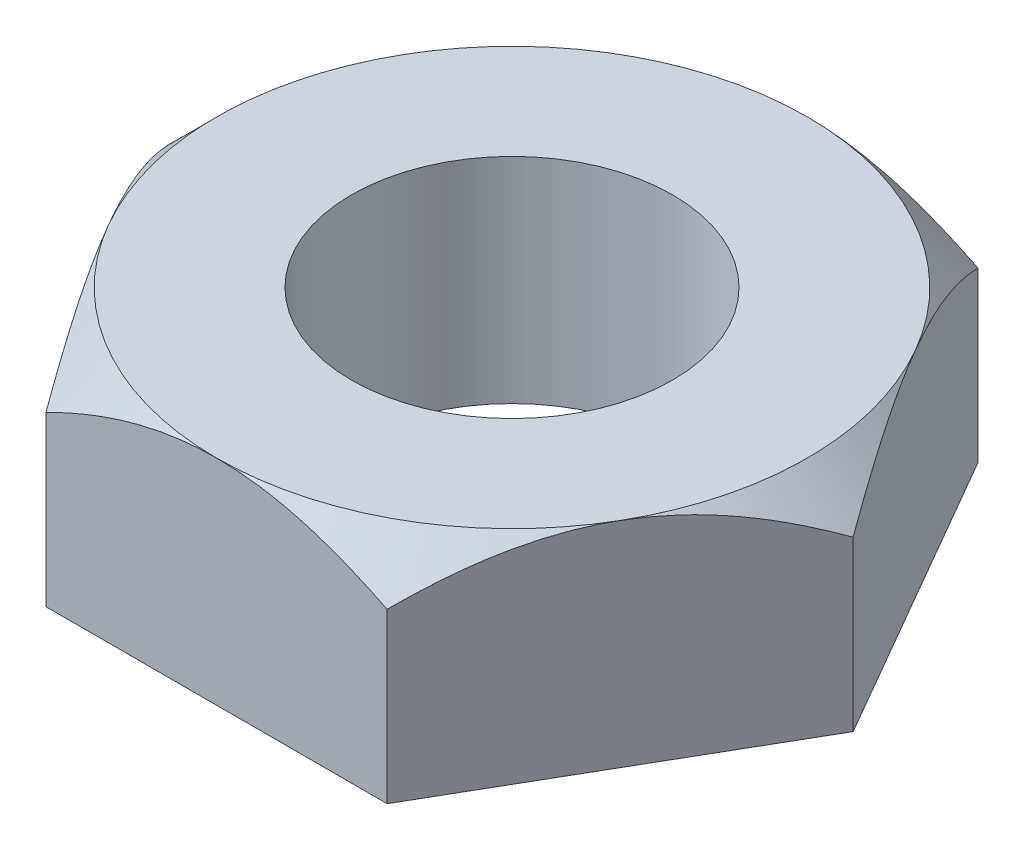
ISO-10303-21;
HEADER;
FILE_DESCRIPTION(('STEP AP214'),'2;1');
FILE_NAME('part.step','',(''),(''),'','','');
FILE_SCHEMA(('AUTOMOTIVE_DESIGN { 1 0 10303 214 1 1 1 1 }'));
ENDSEC;
DATA;
#1=APPLICATION_CONTEXT('core data for automotive mechanical design processes');
#2=APPLICATION_PROTOCOL_DEFINITION('international standard','automotive_design',2000,#1);
#3=PRODUCT_CONTEXT('',#1,'mechanical');
#4=PRODUCT('Part','Part','',(#3));
#5=PRODUCT_RELATED_PRODUCT_CATEGORY('part','',(#4));
#6=PRODUCT_DEFINITION_FORMATION('','',#4);
#7=PRODUCT_DEFINITION_CONTEXT('part definition',#1,'design');
#8=PRODUCT_DEFINITION('design','',#6,#7);
#9=PRODUCT_DEFINITION_SHAPE('','',#8);
#10=(LENGTH_UNIT() NAMED_UNIT(*) SI_UNIT(.MILLI.,.METRE.));
#11=(NAMED_UNIT(*) PLANE_ANGLE_UNIT() SI_UNIT($,.RADIAN.));
#12=(NAMED_UNIT(*) SI_UNIT($,.STERADIAN.) SOLID_ANGLE_UNIT());
#13=UNCERTAINTY_MEASURE_WITH_UNIT(LENGTH_MEASURE(1.E-05),#10,'distance_accuracy_value','');
#14=(GEOMETRIC_REPRESENTATION_CONTEXT(3) GLOBAL_UNCERTAINTY_ASSIGNED_CONTEXT((#13)) GLOBAL_UNIT_ASSIGNED_CONTEXT((#10,
#11,#12)) REPRESENTATION_CONTEXT('',''));
#15=CARTESIAN_POINT('',(0.,0.,0.));
#16=DIRECTION('',(0.,0.,1.));
#17=DIRECTION('',(1.,0.,0.));
#18=AXIS2_PLACEMENT_3D('',#15,#16,#17);
#19=CARTESIAN_POINT('',(-2.22044604925031E-13,12.5000000000002,-8.88178419700125E-13));
#20=DIRECTION('',(0.,1.,0.));
#21=DIRECTION('',(0.,0.,1.));
#22=AXIS2_PLACEMENT_3D('',#19,#20,#21);
#23=PLANE('',#22);
#24=CARTESIAN_POINT('',(-2.22044604925031E-13,12.5000000000002,-8.88178419700125E-13));
#25=DIRECTION('',(0.,1.,0.));
#26=DIRECTION('',(0.,0.,1.));
#27=AXIS2_PLACEMENT_3D('',#24,#25,#26);
#28=CIRCLE('',#27,18.75);
#29=CARTESIAN_POINT('',(-2.22565021967825E-13,12.5000000000002,18.7499999999991));
#30=VERTEX_POINT('',#29);
#31=EDGE_CURVE('E309',#30,#30,#28,.T.);
#32=ORIENTED_EDGE('',*,*,#31,.F.);
#33=EDGE_LOOP('',(#32));
#34=FACE_BOUND('',#33,.T.);
#35=CARTESIAN_POINT('',(-2.22044604925031E-13,12.5000000000002,-8.88178419700125E-13));
#36=DIRECTION('',(0.,1.,0.));
#37=DIRECTION('',(0.,0.,1.));
#38=AXIS2_PLACEMENT_3D('',#35,#36,#37);
#39=CIRCLE('',#38,34.5);
#40=CARTESIAN_POINT('',(-29.8778764305634,12.5000000000002,17.2499999999989));
#41=VERTEX_POINT('',#40);
#42=CARTESIAN_POINT('',(-2.22044604925031E-13,12.5000000000002,34.4999999999986));
#43=VERTEX_POINT('',#42);
#44=EDGE_CURVE('E155',#41,#43,#39,.T.);
#45=ORIENTED_EDGE('',*,*,#44,.T.);
#46=CARTESIAN_POINT('',(29.8778764305634,12.5000000000024,17.2499999999987));
#47=VERTEX_POINT('',#46);
#48=EDGE_CURVE('E131',#43,#47,#39,.T.);
#49=ORIENTED_EDGE('',*,*,#48,.T.);
#50=CARTESIAN_POINT('',(29.8778764305629,12.5000000000024,-17.2500000000002));
#51=VERTEX_POINT('',#50);
#52=EDGE_CURVE('E122',#47,#51,#39,.T.);
#53=ORIENTED_EDGE('',*,*,#52,.T.);
#54=CARTESIAN_POINT('',(-4.44089209850063E-13,12.4999999999997,-34.5000000000013));
#55=VERTEX_POINT('',#54);
#56=EDGE_CURVE('E69',#51,#55,#39,.T.);
#57=ORIENTED_EDGE('',*,*,#56,.T.);
#58=CARTESIAN_POINT('',(-29.8778764305633,12.5000000000002,-17.25));
#59=VERTEX_POINT('',#58);
#60=EDGE_CURVE('E73',#55,#59,#39,.T.);
#61=ORIENTED_EDGE('',*,*,#60,.T.);
#62=EDGE_CURVE('E159',#59,#41,#39,.T.);
#63=ORIENTED_EDGE('',*,*,#62,.T.);
#64=EDGE_LOOP('',(#45,#49,#53,#57,#61,#63));
#65=FACE_BOUND('',#64,.T.);
#66=ADVANCED_FACE('F42',(#34,#65),#23,.T.);
#67=CARTESIAN_POINT('',(19.9185842870426,12.5000000000002,34.4999999999984));
#68=DIRECTION('',(-0.866025403784442,0.,-0.499999999999996));
#69=DIRECTION('',(-0.499999999999996,0.,0.866025403784442));
#70=AXIS2_PLACEMENT_3D('',#67,#68,#69);
#71=PLANE('',#70);
#72=CARTESIAN_POINT('',(19.9184688169888,7.16271595536,34.5001999999985));
#73=CARTESIAN_POINT('',(20.2609064330095,7.50509746026353,33.9070806506278));
#74=CARTESIAN_POINT('',(20.6060258774001,7.83703105759164,33.3093162382632));
#75=CARTESIAN_POINT('',(21.302045761089,8.47668380394302,32.1037744366359));
#76=CARTESIAN_POINT('',(21.6529492327175,8.78438972934077,31.4959917952231));
#77=CARTESIAN_POINT('',(22.3626094509885,9.37357152050351,30.2668242410672));
#78=CARTESIAN_POINT('',(22.7213996575819,9.65488712591795,29.6453813739893));
#79=CARTESIAN_POINT('',(23.4448731210173,10.1851784375075,28.3922885773913));
#80=CARTESIAN_POINT('',(23.809555467321,10.4341590878032,27.7606402249699));
#81=CARTESIAN_POINT('',(24.5389204879797,10.8918858727041,26.4973429519255));
#82=CARTESIAN_POINT('',(24.9035131138701,11.1012027501785,25.8658499998184));
#83=CARTESIAN_POINT('',(25.6378697047824,11.4801830016189,24.5939070734852));
#84=CARTESIAN_POINT('',(26.0076339228207,11.6498444282287,23.9534566610219));
#85=CARTESIAN_POINT('',(26.7506510016065,11.9451967498277,22.6665133296736));
#86=CARTESIAN_POINT('',(27.1238936281482,12.0709899879915,22.020038136953));
#87=CARTESIAN_POINT('',(27.8735591371453,12.2758286124025,20.7215793866877));
#88=CARTESIAN_POINT('',(28.249981535901,12.3548809833566,20.0695966669355));
#89=CARTESIAN_POINT('',(28.8972588629571,12.4485018389402,18.9484794498871));
#90=CARTESIAN_POINT('',(29.1676946202353,12.4750148451499,18.4800709780981));
#91=CARTESIAN_POINT('',(29.7088862428974,12.5025846344725,17.5426995910168));
#92=CARTESIAN_POINT('',(29.979642091504,12.5036426973578,17.0737367047838));
#93=CARTESIAN_POINT('',(30.5209731671225,12.4802774378919,16.1361237780965));
#94=CARTESIAN_POINT('',(30.7915482937673,12.4558449249193,15.6674739114833));
#95=CARTESIAN_POINT('',(31.3318400708228,12.3818619414037,14.7316611027116));
#96=CARTESIAN_POINT('',(31.6015567064353,12.3323110402203,14.2644981861842));
#97=CARTESIAN_POINT('',(32.1398748180916,12.2087619795485,13.3321038661609));
#98=CARTESIAN_POINT('',(32.4084747809343,12.1347375575662,12.8668750836062));
#99=CARTESIAN_POINT('',(32.9437958210045,11.9633022174695,11.939671843844));
#100=CARTESIAN_POINT('',(33.2105168881165,11.8658911735455,11.4776974041572));
#101=CARTESIAN_POINT('',(33.7416511792806,11.6489787120484,10.5577458262187));
#102=CARTESIAN_POINT('',(34.0060647765428,11.5294809388238,10.0997680415484));
#103=CARTESIAN_POINT('',(34.5323490857843,11.2698130461661,9.18821687871615));
#104=CARTESIAN_POINT('',(34.7942195915675,11.1296412651379,8.7346438576963));
#105=CARTESIAN_POINT('',(35.4683958533015,10.7420658707175,7.56693631911651));
#106=CARTESIAN_POINT('',(35.8786169112637,10.4800736636557,6.85641260439058));
#107=CARTESIAN_POINT('',(36.6916483649013,9.91390135412466,5.44820081853805));
#108=CARTESIAN_POINT('',(37.0944585365013,9.60971997839086,4.75051313552157));
#109=CARTESIAN_POINT('',(37.8914764628388,8.9659219717893,3.37003759256203));
#110=CARTESIAN_POINT('',(38.2857067958519,8.62641678294161,2.68721062589852));
#111=CARTESIAN_POINT('',(38.8716032281722,8.09399071892971,1.67240823714619));
#112=CARTESIAN_POINT('',(39.0659430757271,7.91270509794403,1.33580174724596));
#113=CARTESIAN_POINT('',(39.4528920822667,7.5429569196056,0.665586407981141));
#114=CARTESIAN_POINT('',(39.6455013652519,7.354494881617,0.331977343841547));
#115=CARTESIAN_POINT('',(39.8372840441384,7.16271595536222,-0.000200000001226996));
#116=B_SPLINE_CURVE_WITH_KNOTS('',3,(#72,#73,#74,#75,#76,#77,#78,#79,#80,#81,#82,#83,#84,#85,
#86,#87,#88,#89,#90,#91,#92,#93,#94,#95,#96,#97,#98,#99,#100,#101,#102,#103,#104,#105,#106,#107,
#108,#109,#110,#111,#112,#113,#114,#115),.UNSPECIFIED.,.F.,.F.,(4,2,2,2,2,2,2,2,2,2,2,2,2,2,2,2,
2,2,2,2,2,4),(0.,2.29716343643264,4.59557211159846,6.90713979481505,9.2183536145759,
11.493250558525,13.7682591921507,16.0379242228684,18.3072500011216,19.9312579145987,
21.5551841793082,23.1796961526778,24.8042359783151,26.4305247840901,28.0568223387686,
29.6828517907119,31.3090119999006,33.8913592529942,36.4737844580148,39.0482962319261,
40.3348703274368,41.6213514886572),.UNSPECIFIED.);
#117=CARTESIAN_POINT('',(19.9185842870427,7.16283142591578,34.4999999999984));
#118=VERTEX_POINT('',#117);
#119=EDGE_CURVE('E140',#118,#47,#116,.T.);
#120=ORIENTED_EDGE('',*,*,#119,.F.);
#121=DIRECTION('',(0.,-1.,0.));
#122=VECTOR('',#121,1.);
#123=CARTESIAN_POINT('',(19.9185842870426,12.5000000000002,34.4999999999984));
#124=LINE('',#123,#122);
#125=CARTESIAN_POINT('',(19.9185842870429,-12.5000000000002,34.4999999999993));
#126=VERTEX_POINT('',#125);
#127=EDGE_CURVE('E271',#118,#126,#124,.T.);
#128=ORIENTED_EDGE('',*,*,#127,.T.);
#129=DIRECTION('',(0.499999999999995,0.,-0.866025403784443));
#130=VECTOR('',#129,1.);
#131=CARTESIAN_POINT('',(19.9185842870429,-12.5000000000002,34.4999999999993));
#132=LINE('',#131,#130);
#133=CARTESIAN_POINT('',(39.8371685740847,-12.4999999999975,-1.33226762955019E-12));
#134=VERTEX_POINT('',#133);
#135=EDGE_CURVE('E307',#126,#134,#132,.T.);
#136=ORIENTED_EDGE('',*,*,#135,.T.);
#137=DIRECTION('',(0.,-1.,0.));
#138=VECTOR('',#137,1.);
#139=CARTESIAN_POINT('',(39.8371685740844,12.5000000000024,-1.33226762955019E-12));
#140=LINE('',#139,#138);
#141=CARTESIAN_POINT('',(39.8371685740845,7.16283142591845,-1.33226762955019E-12));
#142=VERTEX_POINT('',#141);
#143=EDGE_CURVE('E146',#142,#134,#140,.T.);
#144=ORIENTED_EDGE('',*,*,#143,.F.);
#145=EDGE_CURVE('E130',#47,#142,#116,.T.);
#146=ORIENTED_EDGE('',*,*,#145,.F.);
#147=EDGE_LOOP('',(#120,#128,#136,#144,#146));
#148=FACE_BOUND('',#147,.T.);
#149=ADVANCED_FACE('F46',(#148),#71,.F.);
#150=CARTESIAN_POINT('',(39.8371685740844,12.5000000000024,-1.33226762955019E-12));
#151=DIRECTION('',(-0.866025403784438,0.,0.500000000000001));
#152=DIRECTION('',(0.500000000000001,0.,0.866025403784438));
#153=AXIS2_PLACEMENT_3D('',#150,#151,#152);
#154=PLANE('',#153);
#155=CARTESIAN_POINT('',(39.8372840441382,7.16271595536222,0.000199999998784506));
#156=CARTESIAN_POINT('',(39.4948464281171,7.50509746026423,-0.592919349372533));
#157=CARTESIAN_POINT('',(39.1497269837264,7.83703105759168,-1.19068376173722));
#158=CARTESIAN_POINT('',(38.4537071000375,8.47668380394254,-2.39622556336461));
#159=CARTESIAN_POINT('',(38.1028036284091,8.78438972934041,-3.00400820477725));
#160=CARTESIAN_POINT('',(37.3931434101381,9.37357152050323,-4.23317575893305));
#161=CARTESIAN_POINT('',(37.0343532035447,9.65488712591762,-4.85461862601094));
#162=CARTESIAN_POINT('',(36.3108797401093,10.1851784375071,-6.1077114226089));
#163=CARTESIAN_POINT('',(35.9461973938057,10.4341590878028,-6.73935977503028));
#164=CARTESIAN_POINT('',(35.216832373147,10.8918858727037,-8.00265704807461));
#165=CARTESIAN_POINT('',(34.8522397472567,11.101202750178,-8.63415000018161));
#166=CARTESIAN_POINT('',(34.1178831563443,11.4801830016185,-9.90609292651479));
#167=CARTESIAN_POINT('',(33.7481189383061,11.6498444282283,-10.546543338978));
#168=CARTESIAN_POINT('',(33.0051018595205,11.9451967498271,-11.8334866703263));
#169=CARTESIAN_POINT('',(32.631859232979,12.0709899879908,-12.4799618630469));
#170=CARTESIAN_POINT('',(31.8821937239814,12.2758286124023,-13.7784206133117));
#171=CARTESIAN_POINT('',(31.5057713252252,12.3548809833572,-14.4304033330634));
#172=CARTESIAN_POINT('',(30.8584939981693,12.4485018389406,-15.5515205501118));
#173=CARTESIAN_POINT('',(30.5880582408916,12.4750148451497,-16.0199290219011));
#174=CARTESIAN_POINT('',(30.0468666182299,12.5025846344719,-16.9573004089826));
#175=CARTESIAN_POINT('',(29.7761107696232,12.5036426973574,-17.4262632952155));
#176=CARTESIAN_POINT('',(29.2347796940046,12.4802774378916,-18.3638762219027));
#177=CARTESIAN_POINT('',(28.9642045673597,12.455844924919,-18.832526088516));
#178=CARTESIAN_POINT('',(28.4239127903043,12.3818619414034,-19.7683388972877));
#179=CARTESIAN_POINT('',(28.1541961546918,12.33231104022,-20.2355018138151));
#180=CARTESIAN_POINT('',(27.6158780430354,12.2087619795483,-21.1678961338384));
#181=CARTESIAN_POINT('',(27.3472780801928,12.134737557566,-21.6331249163931));
#182=CARTESIAN_POINT('',(26.8119570401226,11.9633022174694,-22.5603281561553));
#183=CARTESIAN_POINT('',(26.5452359730106,11.8658911735453,-23.0223025958422));
#184=CARTESIAN_POINT('',(26.0141016818464,11.6489787120483,-23.9422541737806));
#185=CARTESIAN_POINT('',(25.7496880845841,11.5294809388237,-24.4002319584508));
#186=CARTESIAN_POINT('',(25.2234037753429,11.2698130461661,-25.3117831212833));
#187=CARTESIAN_POINT('',(24.96153326956,11.1296412651379,-25.7653561423034));
#188=CARTESIAN_POINT('',(24.2873570078262,10.7420658707175,-26.9330636808834));
#189=CARTESIAN_POINT('',(23.8771359498634,10.4800736636557,-27.6435873956091));
#190=CARTESIAN_POINT('',(23.0641044962252,9.91390135412452,-29.0517991814615));
#191=CARTESIAN_POINT('',(22.6612943246253,9.6097199783907,-29.7494868644782));
#192=CARTESIAN_POINT('',(21.8642763982879,8.96592197178909,-31.129962407438));
#193=CARTESIAN_POINT('',(21.4700460652747,8.62641678294139,-31.8127893741016));
#194=CARTESIAN_POINT('',(20.8841496329542,8.09399071892938,-32.8275917628539));
#195=CARTESIAN_POINT('',(20.6898097853993,7.91270509794367,-33.1641982527542));
#196=CARTESIAN_POINT('',(20.3028607788597,7.54295691960528,-33.8344135920192));
#197=CARTESIAN_POINT('',(20.1102514958747,7.35449488161677,-34.1680226561589));
#198=CARTESIAN_POINT('',(19.9184688169884,7.16271595536222,-34.5002000000021));
#199=B_SPLINE_CURVE_WITH_KNOTS('',3,(#155,#156,#157,#158,#159,#160,#161,#162,#163,#164,#165,
#166,#167,#168,#169,#170,#171,#172,#173,#174,#175,#176,#177,#178,#179,#180,#181,#182,#183,#184,
#185,#186,#187,#188,#189,#190,#191,#192,#193,#194,#195,#196,#197,#198),.UNSPECIFIED.,.F.,.F.,(4,
2,2,2,2,2,2,2,2,2,2,2,2,2,2,2,2,2,2,2,2,4),(0.,2.29716343643233,4.59557211159793,
6.90713979481446,9.21835361457522,11.4932505585242,13.7682591921497,16.0379242228671,
18.3072500011201,19.9312579145971,21.5551841793066,23.1796961526763,24.8042359783135,
26.4305247840886,28.0568223387671,29.6828517907104,31.3090119998991,33.891359252993,
36.4737844580139,39.0482962319255,40.3348703274363,41.6213514886569),.UNSPECIFIED.);
#200=EDGE_CURVE('E129',#142,#51,#199,.T.);
#201=ORIENTED_EDGE('',*,*,#200,.F.);
#202=ORIENTED_EDGE('',*,*,#143,.T.);
#203=DIRECTION('',(-0.500000000000002,0.,-0.866025403784439));
#204=VECTOR('',#203,1.);
#205=CARTESIAN_POINT('',(39.8371685740847,-12.4999999999975,-1.33226762955019E-12));
#206=LINE('',#205,#204);
#207=CARTESIAN_POINT('',(19.9185842870424,-12.4999999999975,-34.5000000000013));
#208=VERTEX_POINT('',#207);
#209=EDGE_CURVE('E305',#134,#208,#206,.T.);
#210=ORIENTED_EDGE('',*,*,#209,.T.);
#211=DIRECTION('',(0.,-1.,0.));
#212=VECTOR('',#211,1.);
#213=CARTESIAN_POINT('',(19.9185842870416,12.5000000000024,-34.5000000000013));
#214=LINE('',#213,#212);
#215=CARTESIAN_POINT('',(19.9185842870421,7.16283142591845,-34.5000000000013));
#216=VERTEX_POINT('',#215);
#217=EDGE_CURVE('E274',#216,#208,#214,.T.);
#218=ORIENTED_EDGE('',*,*,#217,.F.);
#219=EDGE_CURVE('E227',#51,#216,#199,.T.);
#220=ORIENTED_EDGE('',*,*,#219,.F.);
#221=EDGE_LOOP('',(#201,#202,#210,#218,#220));
#222=FACE_BOUND('',#221,.T.);
#223=ADVANCED_FACE('F232',(#222),#154,.F.);
#224=CARTESIAN_POINT('',(19.9185842870416,12.5000000000024,-34.5000000000013));
#225=DIRECTION('',(0.,0.,1.));
#226=DIRECTION('',(1.,0.,0.));
#227=AXIS2_PLACEMENT_3D('',#224,#225,#226);
#228=PLANE('',#227);
#229=CARTESIAN_POINT('',(66.9506883522615,-28.3169613755203,-34.5000000000004));
#230=CARTESIAN_POINT('',(65.9736327545982,-27.4484686811342,-34.5000000000011));
#231=CARTESIAN_POINT('',(64.9946224100821,-26.5821681214265,-34.5000000000014));
#232=CARTESIAN_POINT('',(63.0321488539924,-24.8546021956364,-34.5000000000016));
#233=CARTESIAN_POINT('',(62.0486855879725,-23.993336891417,-34.5000000000015));
#234=CARTESIAN_POINT('',(60.0764195265404,-22.2761940103534,-34.5000000000014));
#235=CARTESIAN_POINT('',(59.087614878827,-21.4203185596664,-34.5000000000014));
#236=CARTESIAN_POINT('',(57.1043892947474,-19.7151017929185,-34.5000000000015));
#237=CARTESIAN_POINT('',(56.1099683743324,-18.8657604583159,-34.5000000000014));
#238=CARTESIAN_POINT('',(54.1012147585473,-17.1631010868209,-34.5000000000014));
#239=CARTESIAN_POINT('',(53.0867950366648,-16.3098856461328,-34.5000000000014));
#240=CARTESIAN_POINT('',(51.0505026010359,-14.6123972311891,-34.5000000000014));
#241=CARTESIAN_POINT('',(50.0286299218511,-13.7681242155092,-34.5000000000014));
#242=CARTESIAN_POINT('',(47.9765422469095,-12.0901828468019,-34.5000000000014));
#243=CARTESIAN_POINT('',(46.9463289353291,-11.2565124361504,-34.5000000000014));
#244=CARTESIAN_POINT('',(44.8760715696732,-9.60145739833297,-34.5000000000014));
#245=CARTESIAN_POINT('',(43.8360275414987,-8.78007273881243,-34.5000000000013));
#246=CARTESIAN_POINT('',(41.7931830317413,-7.18974481993274,-34.5000000000013));
#247=CARTESIAN_POINT('',(40.7908991065664,-6.42013889173549,-34.5000000000014));
#248=CARTESIAN_POINT('',(38.7743871386093,-4.89669155464126,-34.5000000000014));
#249=CARTESIAN_POINT('',(37.7601590017218,-4.14285027007987,-34.5000000000014));
#250=CARTESIAN_POINT('',(35.7172343535382,-2.65361461719196,-34.5000000000014));
#251=CARTESIAN_POINT('',(34.6885290857886,-1.9182322342394,-34.5000000000014));
#252=CARTESIAN_POINT('',(32.6150668279873,-0.470429043522095,-34.5000000000014));
#253=CARTESIAN_POINT('',(31.5703101280144,0.241992178473976,-34.5000000000014));
#254=CARTESIAN_POINT('',(29.4656590453809,1.63640597251875,-34.5000000000013));
#255=CARTESIAN_POINT('',(28.4058271847102,2.31849258500111,-34.5000000000013));
#256=CARTESIAN_POINT('',(26.2645519912572,3.64827301364169,-34.5000000000014));
#257=CARTESIAN_POINT('',(25.1831065803661,4.29596350055789,-34.5000000000014));
#258=CARTESIAN_POINT('',(22.996673603827,5.54768666168909,-34.5000000000012));
#259=CARTESIAN_POINT('',(21.8917127483781,6.15176576888,-34.500000000001));
#260=CARTESIAN_POINT('',(19.6540532414779,7.306005111325,-34.5000000000017));
#261=CARTESIAN_POINT('',(18.5213628042395,7.85618107818975,-34.5000000000026));
#262=CARTESIAN_POINT('',(16.8402981501277,8.6122489762866,-34.500000000002));
#263=CARTESIAN_POINT('',(16.3038438143352,8.84473227201407,-34.5000000000015));
#264=CARTESIAN_POINT('',(15.2242126732797,9.29343051127026,-34.5000000000011));
#265=CARTESIAN_POINT('',(14.6810360304632,9.50964584702863,-34.5000000000012));
#266=CARTESIAN_POINT('',(13.0411013558237,10.131349276362,-34.5000000000014));
#267=CARTESIAN_POINT('',(11.9338226343096,10.5099477102892,-34.5000000000013));
#268=CARTESIAN_POINT('',(10.2563319626624,11.011677394015,-34.5000000000013));
#269=CARTESIAN_POINT('',(9.69578159273481,11.1675948450646,-34.5000000000013));
#270=CARTESIAN_POINT('',(8.56870790800372,11.4559974511954,-34.5000000000012));
#271=CARTESIAN_POINT('',(8.0021853782302,11.5884856462992,-34.5000000000012));
#272=CARTESIAN_POINT('',(6.86381955970497,11.8282436529884,-34.5000000000013));
#273=CARTESIAN_POINT('',(6.29197632010594,11.9355136972989,-34.5000000000015));
#274=CARTESIAN_POINT('',(5.14388277987991,12.1232332873694,-34.500000000001));
#275=CARTESIAN_POINT('',(4.56763247869881,12.2036828297572,-34.5000000000002));
#276=CARTESIAN_POINT('',(3.40382280968844,12.3373793970671,-34.5000000000002));
#277=CARTESIAN_POINT('',(2.81621780477597,12.3902313860362,-34.500000000001));
#278=CARTESIAN_POINT('',(1.63907542969258,12.4660802700158,-34.5000000000015));
#279=CARTESIAN_POINT('',(1.04953806226327,12.4890772073658,-34.5000000000013));
#280=CARTESIAN_POINT('',(-0.129912051967752,12.5047947169678,-34.5000000000012));
#281=CARTESIAN_POINT('',(-0.719824777848304,12.4975168501631,-34.5000000000012));
#282=CARTESIAN_POINT('',(-1.89850361882136,12.4528224439892,-34.5000000000013));
#283=CARTESIAN_POINT('',(-2.48726972906466,12.4154057774351,-34.5000000000012));
#284=CARTESIAN_POINT('',(-3.66390366448901,12.3109561559243,-34.5000000000012));
#285=CARTESIAN_POINT('',(-4.25176373985411,12.2438363190931,-34.5000000000012));
#286=CARTESIAN_POINT('',(-5.42350823907122,12.0811259136675,-34.5000000000012));
#287=CARTESIAN_POINT('',(-6.00739267429339,11.9855354265329,-34.5000000000012));
#288=CARTESIAN_POINT('',(-7.17016225809938,11.7674151415771,-34.5000000000012));
#289=CARTESIAN_POINT('',(-7.74904677751324,11.6448820032829,-34.5000000000012));
#290=CARTESIAN_POINT('',(-8.90099226680359,11.3746713924687,-34.5000000000012));
#291=CARTESIAN_POINT('',(-9.47405215923479,11.2269893544595,-34.5000000000013));
#292=CARTESIAN_POINT('',(-10.8194754794184,10.8509120885648,-34.5000000000013));
#293=CARTESIAN_POINT('',(-11.5890814539463,10.6126284063252,-34.5000000000012));
#294=CARTESIAN_POINT('',(-13.1155204265282,10.0980998413656,-34.5000000000012));
#295=CARTESIAN_POINT('',(-13.8723513905921,9.82184897648294,-34.5000000000012));
#296=CARTESIAN_POINT('',(-15.3733670495634,9.23609309248045,-34.5000000000012));
#297=CARTESIAN_POINT('',(-16.1175458693756,8.92657308813269,-34.5000000000012));
#298=CARTESIAN_POINT('',(-17.5932052038206,8.27879989981454,-34.5000000000012));
#299=CARTESIAN_POINT('',(-18.3246860897291,7.94054755766087,-34.5000000000012));
#300=CARTESIAN_POINT('',(-19.7825988513505,7.23581938962351,-34.5000000000012));
#301=CARTESIAN_POINT('',(-20.508913864515,6.86910268081754,-34.5000000000012));
#302=CARTESIAN_POINT('',(-21.9500655006001,6.11383165570203,-34.5000000000011));
#303=CARTESIAN_POINT('',(-22.6649020716867,5.72527724081386,-34.5000000000011));
#304=CARTESIAN_POINT('',(-24.0837153395469,4.92945756782045,-34.5000000000012));
#305=CARTESIAN_POINT('',(-24.7876958690757,4.52219912506286,-34.5000000000014));
#306=CARTESIAN_POINT('',(-26.185938685745,3.69137176337252,-34.5000000000009));
#307=CARTESIAN_POINT('',(-26.8802009847293,3.26780286431992,-34.5000000000001));
#308=CARTESIAN_POINT('',(-28.4840865277051,2.266534463432,-34.4999999999998));
#309=CARTESIAN_POINT('',(-29.3903673590649,1.6834836576385,-34.5000000000008));
#310=CARTESIAN_POINT('',(-31.1892691200147,0.496625491035187,-34.5000000000015));
#311=CARTESIAN_POINT('',(-32.081889159337,-0.107183214303493,-34.5000000000012));
#312=CARTESIAN_POINT('',(-33.8552837421053,-1.33238284838423,-34.500000000001));
#313=CARTESIAN_POINT('',(-34.7360552945146,-1.95377809820664,-34.5000000000011));
#314=CARTESIAN_POINT('',(-36.4869548296835,-3.21132247223791,-34.5000000000011));
#315=CARTESIAN_POINT('',(-37.3570830293139,-3.847471295058,-34.5000000000011));
#316=CARTESIAN_POINT('',(-39.0893387617899,-5.13337840044921,-34.5000000000011));
#317=CARTESIAN_POINT('',(-39.9514515251384,-5.78315655065985,-34.5000000000011));
#318=CARTESIAN_POINT('',(-41.6673832698122,-7.09356773149919,-34.5000000000011));
#319=CARTESIAN_POINT('',(-42.5212022146998,-7.75420080978325,-34.5000000000011));
#320=CARTESIAN_POINT('',(-44.2213790335404,-9.08476075871798,-34.5000000000011));
#321=CARTESIAN_POINT('',(-45.0677378741331,-9.7546863954537,-34.5000000000011));
#322=CARTESIAN_POINT('',(-46.7539261640634,-11.1026946766511,-34.5000000000011));
#323=CARTESIAN_POINT('',(-47.5937556267286,-11.7807773044556,-34.5000000000011));
#324=CARTESIAN_POINT('',(-49.2198357426291,-13.1051794154728,-34.5000000000011));
#325=CARTESIAN_POINT('',(-50.0064089130204,-13.7511032097011,-34.5000000000011));
#326=CARTESIAN_POINT('',(-51.5749001242515,-15.0485806079995,-34.5000000000011));
#327=CARTESIAN_POINT('',(-52.3568181441551,-15.700134237357,-34.5000000000011));
#328=CARTESIAN_POINT('',(-54.6963438510256,-17.6623311271866,-34.500000000001));
#329=CARTESIAN_POINT('',(-56.2476722784196,-18.9804687919714,-34.500000000001));
#330=CARTESIAN_POINT('',(-58.5614353123103,-20.9671763257359,-34.500000000001));
#331=CARTESIAN_POINT('',(-59.3290492884637,-21.6297371098701,-34.500000000001));
#332=CARTESIAN_POINT('',(-60.8611622458126,-22.9584548425943,-34.500000000001));
#333=CARTESIAN_POINT('',(-61.6256612235562,-23.6246117951676,-34.500000000001));
#334=CARTESIAN_POINT('',(-63.1517480925454,-24.9601064450506,-34.500000000001));
#335=CARTESIAN_POINT('',(-63.913336248828,-25.6294438396935,-34.5000000000011));
#336=CARTESIAN_POINT('',(-65.433906580997,-26.9710651214693,-34.5000000000009));
#337=CARTESIAN_POINT('',(-66.1928887695311,-27.6433489942658,-34.5000000000006));
#338=CARTESIAN_POINT('',(-66.9506883522618,-28.3169613755203,-34.4999999999998));
#339=B_SPLINE_CURVE_WITH_KNOTS('',3,(#229,#230,#231,#232,#233,#234,#235,#236,#237,#238,#239,
#240,#241,#242,#243,#244,#245,#246,#247,#248,#249,#250,#251,#252,#253,#254,#255,#256,#257,#258,
#259,#260,#261,#262,#263,#264,#265,#266,#267,#268,#269,#270,#271,#272,#273,#274,#275,#276,#277,
#278,#279,#280,#281,#282,#283,#284,#285,#286,#287,#288,#289,#290,#291,#292,#293,#294,#295,#296,
#297,#298,#299,#300,#301,#302,#303,#304,#305,#306,#307,#308,#309,#310,#311,#312,#313,#314,#315,
#316,#317,#318,#319,#320,#321,#322,#323,#324,#325,#326,#327,#328,#329,#330,#331,#332,#333,#334,
#335,#336,#337,#338),.UNSPECIFIED.,.F.,.F.,(4,2,2,2,2,2,2,2,2,2,2,2,2,2,2,2,2,2,2,2,2,2,2,2,2,2,
2,2,2,2,2,2,2,2,2,2,2,2,2,2,2,2,2,2,2,2,2,2,2,2,2,2,2,2,4),(0.,3.92177036176121,
7.84358880541157,11.7668679460779,15.6901359496109,19.6666752226184,23.6431960668929,
27.6189330445183,31.5946595501851,35.385545114775,39.1764605667782,42.9697769226986,
46.7630248068625,50.5435505822898,54.3244416148673,58.1012458848345,61.8769445918053,
63.6306928488873,65.3843988085543,68.8914289961487,70.6365247866911,72.3813939789327,
74.1262470680568,75.8711003765644,77.6402887685832,79.409474651594,81.1785693180108,
82.9476714499988,84.721982770547,86.4962890145075,88.2708153692285,90.0456642125956,
92.4614344727442,94.8775858023438,97.2948300221992,99.7120034446407,102.152505399212,
104.593018371456,107.032649021074,109.47227669722,112.704817125402,115.937567327368,
119.171118844663,122.404604364436,125.643185629493,128.881781116382,132.119950605696,
135.358113483569,138.411481022114,141.464862282581,147.571822010162,150.613848024235,
153.655877408449,156.697622875062,159.739353558085),.UNSPECIFIED.);
#340=EDGE_CURVE('E234',#216,#55,#339,.T.);
#341=ORIENTED_EDGE('',*,*,#340,.F.);
#342=ORIENTED_EDGE('',*,*,#217,.T.);
#343=DIRECTION('',(-1.,0.,0.));
#344=VECTOR('',#343,1.);
#345=CARTESIAN_POINT('',(19.9185842870424,-12.4999999999975,-34.5000000000013));
#346=LINE('',#345,#344);
#347=CARTESIAN_POINT('',(-19.9185842870417,-12.5000000000002,-34.5000000000009));
#348=VERTEX_POINT('',#347);
#349=EDGE_CURVE('E298',#208,#348,#346,.T.);
#350=ORIENTED_EDGE('',*,*,#349,.T.);
#351=DIRECTION('',(0.,-1.,0.));
#352=VECTOR('',#351,1.);
#353=CARTESIAN_POINT('',(-19.9185842870426,12.5000000000002,-34.5000000000013));
#354=LINE('',#353,#352);
#355=CARTESIAN_POINT('',(-19.9185842870422,7.16283142591578,-34.5000000000013));
#356=VERTEX_POINT('',#355);
#357=EDGE_CURVE('E278',#356,#348,#354,.T.);
#358=ORIENTED_EDGE('',*,*,#357,.F.);
#359=EDGE_CURVE('E176',#55,#356,#339,.T.);
#360=ORIENTED_EDGE('',*,*,#359,.F.);
#361=EDGE_LOOP('',(#341,#342,#350,#358,#360));
#362=FACE_BOUND('',#361,.T.);
#363=ADVANCED_FACE('F237',(#362),#228,.F.);
#364=CARTESIAN_POINT('',(-19.9185842870426,12.5000000000002,-34.5000000000013));
#365=DIRECTION('',(0.866025403784443,0.,0.499999999999995));
#366=DIRECTION('',(0.499999999999995,0.,-0.866025403784443));
#367=AXIS2_PLACEMENT_3D('',#364,#365,#366);
#368=PLANE('',#367);
#369=CARTESIAN_POINT('',(-19.9184688169882,7.16271595536,-34.5002000000012));
#370=CARTESIAN_POINT('',(-20.2609064330094,7.50509746026319,-33.9070806506304));
#371=CARTESIAN_POINT('',(-20.6060258774003,7.83703105759118,-33.3093162382658));
#372=CARTESIAN_POINT('',(-21.3020457610894,8.47668380394253,-32.1037744366383));
#373=CARTESIAN_POINT('',(-21.6529492327178,8.78438972934037,-31.4959917952255));
#374=CARTESIAN_POINT('',(-22.3626094509889,9.37357152050317,-30.2668242410695));
#375=CARTESIAN_POINT('',(-22.7213996575822,9.65488712591759,-29.6453813739917));
#376=CARTESIAN_POINT('',(-23.4448731210176,10.1851784375071,-28.3922885773937));
#377=CARTESIAN_POINT('',(-23.8095554673213,10.4341590878028,-27.7606402249723));
#378=CARTESIAN_POINT('',(-24.53892048798,10.8918858727037,-26.4973429519279));
#379=CARTESIAN_POINT('',(-24.9035131138704,11.1012027501782,-25.8658499998209));
#380=CARTESIAN_POINT('',(-25.6378697047827,11.4801830016185,-24.5939070734875));
#381=CARTESIAN_POINT('',(-26.0076339228209,11.6498444282282,-23.9534566610242));
#382=CARTESIAN_POINT('',(-26.7506510016068,11.9451967498276,-22.666513329676));
#383=CARTESIAN_POINT('',(-27.1238936281487,12.0709899879919,-22.0200381369554));
#384=CARTESIAN_POINT('',(-27.8735591371456,12.2758286124017,-20.7215793866896));
#385=CARTESIAN_POINT('',(-28.2499815359008,12.354880983354,-20.0695966669369));
#386=CARTESIAN_POINT('',(-28.8972588629572,12.4485018389383,-18.9484794498884));
#387=CARTESIAN_POINT('',(-29.1676946202358,12.4750148451492,-18.4800709780998));
#388=CARTESIAN_POINT('',(-29.7088862428982,12.5025846344728,-17.5426995910188));
#389=CARTESIAN_POINT('',(-29.9796420915046,12.5036426973577,-17.0737367047857));
#390=CARTESIAN_POINT('',(-30.520973167123,12.4802774378916,-16.1361237780985));
#391=CARTESIAN_POINT('',(-30.7915482937678,12.4558449249191,-15.6674739114853));
#392=CARTESIAN_POINT('',(-31.3318400708232,12.3818619414035,-14.7316611027138));
#393=CARTESIAN_POINT('',(-31.6015567064356,12.3323110402201,-14.2644981861864));
#394=CARTESIAN_POINT('',(-32.1398748180919,12.2087619795484,-13.3321038661632));
#395=CARTESIAN_POINT('',(-32.4084747809346,12.1347375575662,-12.8668750836086));
#396=CARTESIAN_POINT('',(-32.9437958210047,11.9633022174695,-11.9396718438465));
#397=CARTESIAN_POINT('',(-33.2105168881165,11.8658911735453,-11.4776974041597));
#398=CARTESIAN_POINT('',(-33.7416511792808,11.6489787120486,-10.5577458262214));
#399=CARTESIAN_POINT('',(-34.0060647765432,11.5294809388244,-10.0997680415511));
#400=CARTESIAN_POINT('',(-34.532349085784,11.2698130461657,-9.18821687871887));
#401=CARTESIAN_POINT('',(-34.7942195915664,11.129641265136,-8.73464385769899));
#402=CARTESIAN_POINT('',(-35.4683958532999,10.7420658707147,-7.56693631911903));
#403=CARTESIAN_POINT('',(-35.8786169112635,10.480073663655,-6.85641260439301));
#404=CARTESIAN_POINT('',(-36.6916483649022,9.91390135412548,-5.44820081854034));
#405=CARTESIAN_POINT('',(-37.0944585365018,9.60971997839112,-4.7505131355238));
#406=CARTESIAN_POINT('',(-37.891476462839,8.96592197178906,-3.37003759256418));
#407=CARTESIAN_POINT('',(-38.2857067958522,8.62641678294142,-2.68721062590064));
#408=CARTESIAN_POINT('',(-38.8716032281728,8.09399071892975,-1.67240823714821));
#409=CARTESIAN_POINT('',(-39.0659430757278,7.91270509794417,-1.33580174724791));
#410=CARTESIAN_POINT('',(-39.4528920822671,7.54295691960525,-0.665586407983035));
#411=CARTESIAN_POINT('',(-39.6455013652519,7.35449488161606,-0.331977343843449));
#412=CARTESIAN_POINT('',(-39.8372840441376,7.16271595536,0.000199999999228595));
#413=B_SPLINE_CURVE_WITH_KNOTS('',3,(#369,#370,#371,#372,#373,#374,#375,#376,#377,#378,#379,
#380,#381,#382,#383,#384,#385,#386,#387,#388,#389,#390,#391,#392,#393,#394,#395,#396,#397,#398,
#399,#400,#401,#402,#403,#404,#405,#406,#407,#408,#409,#410,#411,#412),.UNSPECIFIED.,.F.,.F.,(4,
2,2,2,2,2,2,2,2,2,2,2,2,2,2,2,2,2,2,2,2,4),(0.,2.29716343643295,4.59557211159904,
6.90713979481549,9.21835361457624,11.4932505585255,13.7682591921511,16.037924222869,
18.3072500011226,19.9312579145997,21.5551841793091,23.1796961526785,24.8042359783156,
26.4305247840904,28.0568223387686,29.6828517907118,31.3090119999005,33.8913592529944,
36.4737844580152,39.0482962319266,40.3348703274375,41.6213514886582),.UNSPECIFIED.);
#414=EDGE_CURVE('E179',#356,#59,#413,.T.);
#415=ORIENTED_EDGE('',*,*,#414,.F.);
#416=ORIENTED_EDGE('',*,*,#357,.T.);
#417=DIRECTION('',(-0.499999999999995,0.,0.866025403784443));
#418=VECTOR('',#417,1.);
#419=CARTESIAN_POINT('',(-19.9185842870417,-12.5000000000002,-34.5000000000009));
#420=LINE('',#419,#418);
#421=CARTESIAN_POINT('',(-39.8371685740836,-12.4999999999997,-2.22044604925031E-13));
#422=VERTEX_POINT('',#421);
#423=EDGE_CURVE('E300',#348,#422,#420,.T.);
#424=ORIENTED_EDGE('',*,*,#423,.T.);
#425=DIRECTION('',(0.,-1.,0.));
#426=VECTOR('',#425,1.);
#427=CARTESIAN_POINT('',(-39.8371685740844,12.5000000000002,-1.11022302462516E-12));
#428=LINE('',#427,#426);
#429=CARTESIAN_POINT('',(-39.8371685740838,7.16283142591578,-1.11022302462516E-12));
#430=VERTEX_POINT('',#429);
#431=EDGE_CURVE('E189',#430,#422,#428,.T.);
#432=ORIENTED_EDGE('',*,*,#431,.F.);
#433=EDGE_CURVE('E174',#59,#430,#413,.T.);
#434=ORIENTED_EDGE('',*,*,#433,.F.);
#435=EDGE_LOOP('',(#415,#416,#424,#432,#434));
#436=FACE_BOUND('',#435,.T.);
#437=ADVANCED_FACE('F187',(#436),#368,.F.);
#438=CARTESIAN_POINT('',(-39.8371685740844,12.5000000000002,-1.11022302462516E-12));
#439=DIRECTION('',(0.866025403784435,0.,-0.500000000000008));
#440=DIRECTION('',(-0.500000000000008,0.,-0.866025403784435));
#441=AXIS2_PLACEMENT_3D('',#438,#439,#440);
#442=PLANE('',#441);
#443=CARTESIAN_POINT('',(-39.837284044138,7.16271595536,-0.000199999999894729));
#444=CARTESIAN_POINT('',(-39.494846428117,7.50509746026379,0.592919349370679));
#445=CARTESIAN_POINT('',(-39.1497269837263,7.83703105759202,1.19068376173513));
#446=CARTESIAN_POINT('',(-38.4537071000373,8.47668380394351,2.39622556336245));
#447=CARTESIAN_POINT('',(-38.1028036284088,8.78438972934125,3.00400820477526));
#448=CARTESIAN_POINT('',(-37.3931434101378,9.37357152050393,4.2331757589311));
#449=CARTESIAN_POINT('',(-37.0343532035445,9.65488712591833,4.85461862600885));
#450=CARTESIAN_POINT('',(-36.3108797401092,10.1851784375078,6.1077114226066));
#451=CARTESIAN_POINT('',(-35.9461973938056,10.4341590878034,6.7393597750279));
#452=CARTESIAN_POINT('',(-35.2168323731469,10.8918858727043,8.00265704807213));
#453=CARTESIAN_POINT('',(-34.8522397472566,11.1012027501788,8.63415000017911));
#454=CARTESIAN_POINT('',(-34.1178831563443,11.4801830016191,9.90609292651227));
#455=CARTESIAN_POINT('',(-33.7481189383061,11.6498444282287,10.5465433389755));
#456=CARTESIAN_POINT('',(-33.0051018595204,11.9451967498281,11.8334866703236));
#457=CARTESIAN_POINT('',(-32.6318592329787,12.0709899879926,12.4799618630442));
#458=CARTESIAN_POINT('',(-31.8821937239814,12.2758286124021,13.7784206133096));
#459=CARTESIAN_POINT('',(-31.5057713252256,12.3548809833539,14.430403333062));
#460=CARTESIAN_POINT('',(-30.8584939981694,12.4485018389384,15.5515205501106));
#461=CARTESIAN_POINT('',(-30.5880582408912,12.4750148451497,16.0199290218995));
#462=CARTESIAN_POINT('',(-30.0468666182291,12.5025846344736,16.9573004089808));
#463=CARTESIAN_POINT('',(-29.7761107696225,12.5036426973584,17.4262632952139));
#464=CARTESIAN_POINT('',(-29.2347796940039,12.4802774378922,18.3638762219012));
#465=CARTESIAN_POINT('',(-28.9642045673591,12.4558449249198,18.8325260885144));
#466=CARTESIAN_POINT('',(-28.4239127903036,12.3818619414042,19.7683388972861));
#467=CARTESIAN_POINT('',(-28.1541961546911,12.3323110402208,20.2355018138135));
#468=CARTESIAN_POINT('',(-27.6158780430347,12.2087619795491,21.1678961338369));
#469=CARTESIAN_POINT('',(-27.3472780801921,12.1347375575669,21.6331249163915));
#470=CARTESIAN_POINT('',(-26.8119570401218,11.9633022174701,22.5603281561537));
#471=CARTESIAN_POINT('',(-26.5452359730099,11.8658911735459,23.0223025958405));
#472=CARTESIAN_POINT('',(-26.0141016818457,11.6489787120492,23.9422541737791));
#473=CARTESIAN_POINT('',(-25.7496880845835,11.5294809388251,24.4002319584495));
#474=CARTESIAN_POINT('',(-25.223403775342,11.2698130461661,25.3117831212816));
#475=CARTESIAN_POINT('',(-24.9615332695589,11.1296412651361,25.765356142301));
#476=CARTESIAN_POINT('',(-24.2873570078249,10.7420658707146,26.9330636808808));
#477=CARTESIAN_POINT('',(-23.8771359498623,10.4800736636552,27.6435873956076));
#478=CARTESIAN_POINT('',(-23.0641044962243,9.91390135412587,29.0517991814608));
#479=CARTESIAN_POINT('',(-22.6612943246243,9.60971997839136,29.7494868644772));
#480=CARTESIAN_POINT('',(-21.8642763982868,8.96592197178915,31.1299624074367));
#481=CARTESIAN_POINT('',(-21.4700460652737,8.62641678294152,31.8127893741003));
#482=CARTESIAN_POINT('',(-20.8841496329532,8.0939907189298,32.8275917628528));
#483=CARTESIAN_POINT('',(-20.6898097853982,7.91270509794419,33.1641982527531));
#484=CARTESIAN_POINT('',(-20.3028607788587,7.54295691960524,33.834413592018));
#485=CARTESIAN_POINT('',(-20.1102514958738,7.35449488161605,34.1680226561575));
#486=CARTESIAN_POINT('',(-19.9184688169879,7.16271595536,34.5002000000001));
#487=B_SPLINE_CURVE_WITH_KNOTS('',3,(#443,#444,#445,#446,#447,#448,#449,#450,#451,#452,#453,
#454,#455,#456,#457,#458,#459,#460,#461,#462,#463,#464,#465,#466,#467,#468,#469,#470,#471,#472,
#473,#474,#475,#476,#477,#478,#479,#480,#481,#482,#483,#484,#485,#486),.UNSPECIFIED.,.F.,.F.,(4,
2,2,2,2,2,2,2,2,2,2,2,2,2,2,2,2,2,2,2,2,4),(0.,2.29716343643281,4.59557211159871,
6.90713979481485,9.21835361457531,11.4932505585243,13.7682591921496,16.0379242228673,
18.3072500011207,19.9312579145981,21.5551841793076,23.1796961526773,24.8042359783146,
26.4305247840896,28.056822338768,29.6828517907115,31.3090119999004,33.8913592529945,
36.4737844580155,39.048296231927,40.3348703274379,41.6213514886587),.UNSPECIFIED.);
#488=EDGE_CURVE('E160',#430,#41,#487,.T.);
#489=ORIENTED_EDGE('',*,*,#488,.F.);
#490=ORIENTED_EDGE('',*,*,#431,.T.);
#491=DIRECTION('',(0.500000000000008,0.,0.866025403784435));
#492=VECTOR('',#491,1.);
#493=CARTESIAN_POINT('',(-39.8371685740836,-12.4999999999997,-2.22044604925031E-13));
#494=LINE('',#493,#492);
#495=CARTESIAN_POINT('',(-19.9185842870415,-12.4999999999997,34.4999999999991));
#496=VERTEX_POINT('',#495);
#497=EDGE_CURVE('E294',#422,#496,#494,.T.);
#498=ORIENTED_EDGE('',*,*,#497,.T.);
#499=DIRECTION('',(0.,-1.,0.));
#500=VECTOR('',#499,1.);
#501=CARTESIAN_POINT('',(-19.9185842870422,12.5000000000002,34.4999999999989));
#502=LINE('',#501,#500);
#503=CARTESIAN_POINT('',(-19.9185842870419,7.16283142591578,34.4999999999989));
#504=VERTEX_POINT('',#503);
#505=EDGE_CURVE('E270',#504,#496,#502,.T.);
#506=ORIENTED_EDGE('',*,*,#505,.F.);
#507=EDGE_CURVE('E152',#41,#504,#487,.T.);
#508=ORIENTED_EDGE('',*,*,#507,.F.);
#509=EDGE_LOOP('',(#489,#490,#498,#506,#508));
#510=FACE_BOUND('',#509,.T.);
#511=ADVANCED_FACE('F241',(#510),#442,.F.);
#512=CARTESIAN_POINT('',(-19.9185842870422,12.5000000000002,34.4999999999989));
#513=DIRECTION('',(0.,0.,-1.));
#514=DIRECTION('',(-1.,0.,0.));
#515=AXIS2_PLACEMENT_3D('',#512,#513,#514);
#516=PLANE('',#515);
#517=CARTESIAN_POINT('',(-66.9506883522619,-28.3169613755203,34.5000000000004));
#518=CARTESIAN_POINT('',(-65.9736327545986,-27.4484686811341,34.4999999999997));
#519=CARTESIAN_POINT('',(-64.9946224100825,-26.5821681214263,34.4999999999994));
#520=CARTESIAN_POINT('',(-63.0321488539926,-24.8546021956361,34.4999999999992));
#521=CARTESIAN_POINT('',(-62.0486855879727,-23.9933368914166,34.4999999999993));
#522=CARTESIAN_POINT('',(-60.0764195265405,-22.2761940103529,34.4999999999993));
#523=CARTESIAN_POINT('',(-59.087614878827,-21.4203185596658,34.4999999999993));
#524=CARTESIAN_POINT('',(-57.1043892947473,-19.7151017929179,34.4999999999992));
#525=CARTESIAN_POINT('',(-56.1099683743322,-18.8657604583152,34.4999999999992));
#526=CARTESIAN_POINT('',(-54.101214758547,-17.16310108682,34.4999999999992));
#527=CARTESIAN_POINT('',(-53.0867950366644,-16.3098856461319,34.4999999999992));
#528=CARTESIAN_POINT('',(-51.0505026010354,-14.612397231188,34.4999999999992));
#529=CARTESIAN_POINT('',(-50.0286299218506,-13.768124215508,34.4999999999993));
#530=CARTESIAN_POINT('',(-47.9765422469088,-12.0901828468008,34.4999999999991));
#531=CARTESIAN_POINT('',(-46.9463289353281,-11.2565124361494,34.4999999999988));
#532=CARTESIAN_POINT('',(-44.8760715696725,-9.60145739833124,34.4999999999995));
#533=CARTESIAN_POINT('',(-43.8360275414986,-8.7800727388098,34.5000000000005));
#534=CARTESIAN_POINT('',(-41.7931830317411,-7.18974481993015,34.5000000000004));
#535=CARTESIAN_POINT('',(-40.7908991065657,-6.42013889173376,34.4999999999994));
#536=CARTESIAN_POINT('',(-38.7743871386082,-4.89669155464022,34.4999999999987));
#537=CARTESIAN_POINT('',(-37.7601590017209,-4.14285027007867,34.499999999999));
#538=CARTESIAN_POINT('',(-35.7172343535376,-2.65361461719071,34.4999999999991));
#539=CARTESIAN_POINT('',(-34.6885290857881,-1.91823223423828,34.499999999999));
#540=CARTESIAN_POINT('',(-32.6150668279869,-0.470429043521158,34.499999999999));
#541=CARTESIAN_POINT('',(-31.5703101280142,0.241992178474853,34.499999999999));
#542=CARTESIAN_POINT('',(-29.4656590453809,1.63640597251956,34.499999999999));
#543=CARTESIAN_POINT('',(-28.4058271847103,2.3184925850019,34.4999999999989));
#544=CARTESIAN_POINT('',(-26.2645519912574,3.64827301364218,34.4999999999989));
#545=CARTESIAN_POINT('',(-25.1831065803664,4.29596350055809,34.4999999999989));
#546=CARTESIAN_POINT('',(-22.9966736038279,5.54768666168977,34.4999999999989));
#547=CARTESIAN_POINT('',(-21.8917127483794,6.15176576888144,34.4999999999988));
#548=CARTESIAN_POINT('',(-19.6540532414783,7.30600511132432,34.499999999999));
#549=CARTESIAN_POINT('',(-18.5213628042385,7.85618107818619,34.4999999999992));
#550=CARTESIAN_POINT('',(-16.8402981501274,8.61224897628504,34.499999999999));
#551=CARTESIAN_POINT('',(-16.3038438143355,8.84473227201408,34.4999999999989));
#552=CARTESIAN_POINT('',(-15.2242126732804,9.29343051127149,34.4999999999988));
#553=CARTESIAN_POINT('',(-14.6810360304636,9.50964584702953,34.4999999999988));
#554=CARTESIAN_POINT('',(-13.0411013558237,10.1313492763624,34.4999999999988));
#555=CARTESIAN_POINT('',(-11.9338226343097,10.5099477102899,34.4999999999988));
#556=CARTESIAN_POINT('',(-10.2563319626625,11.0116773940159,34.4999999999988));
#557=CARTESIAN_POINT('',(-9.69578159273485,11.1675948450655,34.4999999999988));
#558=CARTESIAN_POINT('',(-8.56870790800365,11.4559974511962,34.4999999999987));
#559=CARTESIAN_POINT('',(-8.00218537823005,11.5884856462998,34.4999999999987));
#560=CARTESIAN_POINT('',(-6.86381955970473,11.8282436529896,34.4999999999987));
#561=CARTESIAN_POINT('',(-6.29197632010569,11.9355136973008,34.4999999999987));
#562=CARTESIAN_POINT('',(-5.14388277987915,12.1232332873694,34.4999999999987));
#563=CARTESIAN_POINT('',(-4.56763247869756,12.2036828297545,34.4999999999986));
#564=CARTESIAN_POINT('',(-3.40382280968686,12.3373793970644,34.4999999999986));
#565=CARTESIAN_POINT('',(-2.81621780477456,12.3902313860362,34.4999999999987));
#566=CARTESIAN_POINT('',(-1.63907542969123,12.4660802700177,34.4999999999987));
#567=CARTESIAN_POINT('',(-1.04953806226181,12.4890772073669,34.4999999999987));
#568=CARTESIAN_POINT('',(0.129912051969255,12.5047947169683,34.4999999999987));
#569=CARTESIAN_POINT('',(0.719824777849748,12.4975168501638,34.4999999999987));
#570=CARTESIAN_POINT('',(1.89850361882275,12.45282244399,34.4999999999986));
#571=CARTESIAN_POINT('',(2.48726972906607,12.4154057774358,34.4999999999986));
#572=CARTESIAN_POINT('',(3.66390366449038,12.3109561559249,34.4999999999986));
#573=CARTESIAN_POINT('',(4.25176373985544,12.2438363190937,34.4999999999986));
#574=CARTESIAN_POINT('',(5.42350823907244,12.081125913668,34.4999999999986));
#575=CARTESIAN_POINT('',(6.00739267429455,11.9855354265334,34.4999999999986));
#576=CARTESIAN_POINT('',(7.1701622581005,11.7674151415776,34.4999999999986));
#577=CARTESIAN_POINT('',(7.74904677751438,11.6448820032835,34.4999999999986));
#578=CARTESIAN_POINT('',(8.90099226680467,11.3746713924691,34.4999999999986));
#579=CARTESIAN_POINT('',(9.4740521592358,11.2269893544596,34.4999999999986));
#580=CARTESIAN_POINT('',(10.8194754794193,10.8509120885648,34.4999999999986));
#581=CARTESIAN_POINT('',(11.5890814539473,10.6126284063255,34.4999999999986));
#582=CARTESIAN_POINT('',(13.1155204265292,10.098099841366,34.4999999999985));
#583=CARTESIAN_POINT('',(13.872351390593,9.82184897648329,34.4999999999985));
#584=CARTESIAN_POINT('',(15.3733670495642,9.23609309248073,34.4999999999985));
#585=CARTESIAN_POINT('',(16.1175458693763,8.926573088133,34.4999999999985));
#586=CARTESIAN_POINT('',(17.5932052038212,8.27879989981489,34.4999999999985));
#587=CARTESIAN_POINT('',(18.3246860897296,7.94054755766123,34.4999999999985));
#588=CARTESIAN_POINT('',(19.782598851351,7.23581938962388,34.4999999999985));
#589=CARTESIAN_POINT('',(20.5089138645154,6.86910268081792,34.4999999999984));
#590=CARTESIAN_POINT('',(21.9500655006005,6.11383165570239,34.4999999999985));
#591=CARTESIAN_POINT('',(22.6649020716871,5.72527724081419,34.4999999999985));
#592=CARTESIAN_POINT('',(24.0837153395472,4.92945756782081,34.4999999999983));
#593=CARTESIAN_POINT('',(24.787695869076,4.52219912506327,34.4999999999981));
#594=CARTESIAN_POINT('',(26.1859386857453,3.69137176337278,34.4999999999987));
#595=CARTESIAN_POINT('',(26.8802009847295,3.26780286431997,34.4999999999994));
#596=CARTESIAN_POINT('',(28.4840865277053,2.26653446343189,34.4999999999997));
#597=CARTESIAN_POINT('',(29.3903673590653,1.68348365763858,34.4999999999987));
#598=CARTESIAN_POINT('',(31.1892691200153,0.496625491035343,34.499999999998));
#599=CARTESIAN_POINT('',(32.0818891593376,-0.107183214303456,34.4999999999982));
#600=CARTESIAN_POINT('',(33.855283742106,-1.33238284838435,34.4999999999984));
#601=CARTESIAN_POINT('',(34.7360552945154,-1.95377809820679,34.4999999999983));
#602=CARTESIAN_POINT('',(36.4869548296844,-3.21132247223817,34.4999999999983));
#603=CARTESIAN_POINT('',(37.3570830293148,-3.84747129505832,34.4999999999983));
#604=CARTESIAN_POINT('',(39.089338761791,-5.13337840044964,34.4999999999983));
#605=CARTESIAN_POINT('',(39.9514515251395,-5.78315655066032,34.4999999999983));
#606=CARTESIAN_POINT('',(41.6673832698134,-7.09356773149977,34.4999999999982));
#607=CARTESIAN_POINT('',(42.521202214701,-7.75420080978388,34.4999999999982));
#608=CARTESIAN_POINT('',(44.2213790335418,-9.08476075871871,34.4999999999982));
#609=CARTESIAN_POINT('',(45.0677378741345,-9.75468639545446,34.4999999999982));
#610=CARTESIAN_POINT('',(46.7539261640648,-11.1026946766519,34.4999999999982));
#611=CARTESIAN_POINT('',(47.5937556267301,-11.7807773044565,34.4999999999982));
#612=CARTESIAN_POINT('',(49.2198357426306,-13.1051794154737,34.4999999999982));
#613=CARTESIAN_POINT('',(50.0064089130218,-13.751103209702,34.4999999999981));
#614=CARTESIAN_POINT('',(51.5749001242527,-15.0485806080002,34.4999999999981));
#615=CARTESIAN_POINT('',(52.3568181441562,-15.7001342373577,34.4999999999981));
#616=CARTESIAN_POINT('',(54.6963438510265,-17.6623311271871,34.4999999999981));
#617=CARTESIAN_POINT('',(56.2476722784203,-18.9804687919717,34.4999999999981));
#618=CARTESIAN_POINT('',(58.5614353123108,-20.967176325736,34.4999999999981));
#619=CARTESIAN_POINT('',(59.3290492884641,-21.6297371098702,34.499999999998));
#620=CARTESIAN_POINT('',(60.8611622458129,-22.9584548425943,34.499999999998));
#621=CARTESIAN_POINT('',(61.6256612235564,-23.6246117951675,34.4999999999981));
#622=CARTESIAN_POINT('',(63.1517480925454,-24.9601064450504,34.499999999998));
#623=CARTESIAN_POINT('',(63.9133362488279,-25.6294438396933,34.4999999999979));
#624=CARTESIAN_POINT('',(65.4339065809968,-26.971065121469,34.4999999999981));
#625=CARTESIAN_POINT('',(66.1928887695308,-27.6433489942654,34.4999999999983));
#626=CARTESIAN_POINT('',(66.9506883522615,-28.3169613755199,34.4999999999989));
#627=B_SPLINE_CURVE_WITH_KNOTS('',3,(#517,#518,#519,#520,#521,#522,#523,#524,#525,#526,#527,
#528,#529,#530,#531,#532,#533,#534,#535,#536,#537,#538,#539,#540,#541,#542,#543,#544,#545,#546,
#547,#548,#549,#550,#551,#552,#553,#554,#555,#556,#557,#558,#559,#560,#561,#562,#563,#564,#565,
#566,#567,#568,#569,#570,#571,#572,#573,#574,#575,#576,#577,#578,#579,#580,#581,#582,#583,#584,
#585,#586,#587,#588,#589,#590,#591,#592,#593,#594,#595,#596,#597,#598,#599,#600,#601,#602,#603,
#604,#605,#606,#607,#608,#609,#610,#611,#612,#613,#614,#615,#616,#617,#618,#619,#620,#621,#622,
#623,#624,#625,#626),.UNSPECIFIED.,.F.,.F.,(4,2,2,2,2,2,2,2,2,2,2,2,2,2,2,2,2,2,2,2,2,2,2,2,2,2,
2,2,2,2,2,2,2,2,2,2,2,2,2,2,2,2,2,2,2,2,2,2,2,2,2,2,2,2,4),(0.,3.92177036176148,
7.84358880541212,11.7668679460787,15.6901359496119,19.6666752226197,23.6431960668945,
27.6189330445202,31.5946595501873,35.385545114777,39.17646056678,42.9697769226999,
46.7630248068636,50.5435505822905,54.3244416148674,58.1012458848344,61.8769445918052,
63.6306928488876,65.3843988085547,68.8914289961494,70.6365247866919,72.3813939789337,
74.126247068058,75.8711003765661,77.6402887685852,79.4094746515961,81.1785693180128,
82.9476714500008,84.7219827705489,86.4962890145092,88.2708153692303,90.0456642125973,
92.4614344727458,94.8775858023454,97.2948300222006,99.7120034446418,102.152505399214,
104.593018371457,107.032649021075,109.472276697221,112.704817125404,115.93756732737,
119.171118844664,122.404604364438,125.643185629495,128.881781116384,132.119950605698,
135.358113483572,138.411481022117,141.464862282583,147.571822010163,150.613848024236,
153.65587740845,156.697622875063,159.739353558085),.UNSPECIFIED.);
#628=EDGE_CURVE('E12',#504,#43,#627,.T.);
#629=ORIENTED_EDGE('',*,*,#628,.F.);
#630=ORIENTED_EDGE('',*,*,#505,.T.);
#631=DIRECTION('',(1.,0.,0.));
#632=VECTOR('',#631,1.);
#633=CARTESIAN_POINT('',(-19.9185842870415,-12.4999999999997,34.4999999999991));
#634=LINE('',#633,#632);
#635=EDGE_CURVE('E292',#496,#126,#634,.T.);
#636=ORIENTED_EDGE('',*,*,#635,.T.);
#637=ORIENTED_EDGE('',*,*,#127,.F.);
#638=EDGE_CURVE('E47',#43,#118,#627,.T.);
#639=ORIENTED_EDGE('',*,*,#638,.F.);
#640=EDGE_LOOP('',(#629,#630,#636,#637,#639));
#641=FACE_BOUND('',#640,.T.);
#642=ADVANCED_FACE('F254',(#641),#516,.F.);
#643=CARTESIAN_POINT('',(0.,-12.5000000000002,0.));
#644=DIRECTION('',(0.,1.,0.));
#645=DIRECTION('',(0.,0.,1.));
#646=AXIS2_PLACEMENT_3D('',#643,#644,#645);
#647=PLANE('',#646);
#648=ORIENTED_EDGE('',*,*,#135,.F.);
#649=ORIENTED_EDGE('',*,*,#635,.F.);
#650=ORIENTED_EDGE('',*,*,#497,.F.);
#651=ORIENTED_EDGE('',*,*,#423,.F.);
#652=ORIENTED_EDGE('',*,*,#349,.F.);
#653=ORIENTED_EDGE('',*,*,#209,.F.);
#654=EDGE_LOOP('',(#648,#649,#650,#651,#652,#653));
#655=FACE_BOUND('',#654,.T.);
#656=CARTESIAN_POINT('',(0.,-12.5000000000002,0.));
#657=DIRECTION('',(0.,1.,0.));
#658=DIRECTION('',(0.,0.,1.));
#659=AXIS2_PLACEMENT_3D('',#656,#657,#658);
#660=CIRCLE('',#659,18.75);
#661=CARTESIAN_POINT('',(0.,-12.5000000000002,18.75));
#662=VERTEX_POINT('',#661);
#663=EDGE_CURVE('E145',#662,#662,#660,.T.);
#664=ORIENTED_EDGE('',*,*,#663,.T.);
#665=EDGE_LOOP('',(#664));
#666=FACE_BOUND('',#665,.T.);
#667=ADVANCED_FACE('F251',(#655,#666),#647,.F.);
#668=CARTESIAN_POINT('',(-2.22044604925031E-13,12.5000000000002,-8.88178419700125E-13));
#669=DIRECTION('',(0.,-1.,0.));
#670=DIRECTION('',(0.,0.,-1.));
#671=AXIS2_PLACEMENT_3D('',#668,#669,#670);
#672=CYLINDRICAL_SURFACE('',#671,18.75);
#673=ORIENTED_EDGE('',*,*,#31,.T.);
#674=EDGE_LOOP('',(#673));
#675=FACE_BOUND('',#674,.T.);
#676=ORIENTED_EDGE('',*,*,#663,.F.);
#677=EDGE_LOOP('',(#676));
#678=FACE_BOUND('',#677,.T.);
#679=ADVANCED_FACE('F212',(#675,#678),#672,.F.);
#680=CARTESIAN_POINT('',(-2.22044604925031E-13,12.5000000000002,-8.88178419700125E-13));
#681=DIRECTION('',(0.,-1.,0.));
#682=DIRECTION('',(0.,0.,1.));
#683=AXIS2_PLACEMENT_3D('',#680,#681,#682);
#684=CONICAL_SURFACE('',#683,34.5,0.78539816339745);
#685=ORIENTED_EDGE('',*,*,#119,.T.);
#686=ORIENTED_EDGE('',*,*,#48,.F.);
#687=ORIENTED_EDGE('',*,*,#638,.T.);
#688=EDGE_LOOP('',(#685,#686,#687));
#689=FACE_BOUND('',#688,.T.);
#690=ADVANCED_FACE('F136',(#689),#684,.T.);
#691=ORIENTED_EDGE('',*,*,#507,.T.);
#692=ORIENTED_EDGE('',*,*,#628,.T.);
#693=ORIENTED_EDGE('',*,*,#44,.F.);
#694=EDGE_LOOP('',(#691,#692,#693));
#695=FACE_BOUND('',#694,.T.);
#696=ADVANCED_FACE('F213',(#695),#684,.T.);
#697=ORIENTED_EDGE('',*,*,#433,.T.);
#698=ORIENTED_EDGE('',*,*,#488,.T.);
#699=ORIENTED_EDGE('',*,*,#62,.F.);
#700=EDGE_LOOP('',(#697,#698,#699));
#701=FACE_BOUND('',#700,.T.);
#702=ADVANCED_FACE('F172',(#701),#684,.T.);
#703=ORIENTED_EDGE('',*,*,#359,.T.);
#704=ORIENTED_EDGE('',*,*,#414,.T.);
#705=ORIENTED_EDGE('',*,*,#60,.F.);
#706=EDGE_LOOP('',(#703,#704,#705));
#707=FACE_BOUND('',#706,.T.);
#708=ADVANCED_FACE('F177',(#707),#684,.T.);
#709=ORIENTED_EDGE('',*,*,#219,.T.);
#710=ORIENTED_EDGE('',*,*,#340,.T.);
#711=ORIENTED_EDGE('',*,*,#56,.F.);
#712=EDGE_LOOP('',(#709,#710,#711));
#713=FACE_BOUND('',#712,.T.);
#714=ADVANCED_FACE('F348',(#713),#684,.T.);
#715=ORIENTED_EDGE('',*,*,#145,.T.);
#716=ORIENTED_EDGE('',*,*,#200,.T.);
#717=ORIENTED_EDGE('',*,*,#52,.F.);
#718=EDGE_LOOP('',(#715,#716,#717));
#719=FACE_BOUND('',#718,.T.);
#720=ADVANCED_FACE('F121',(#719),#684,.T.);
#721=CLOSED_SHELL('',(#66,#149,#223,#363,#437,#511,#642,#667,#679,#690,#696,#702,#708,#714,#720));
#722=MANIFOLD_SOLID_BREP('B2',#721);
#723=ADVANCED_BREP_SHAPE_REPRESENTATION('',(#18,#722),#14);
#724=SHAPE_DEFINITION_REPRESENTATION(#9,#723);
ENDSEC;
END-ISO-10303-21;
